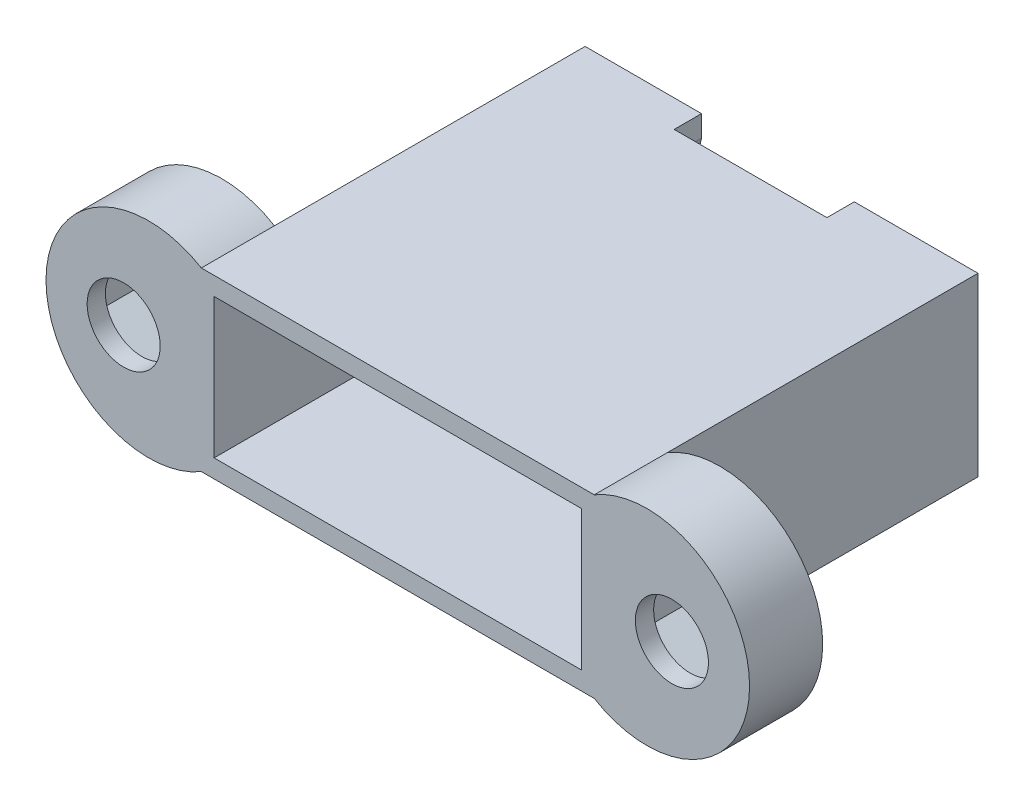
ISO-10303-21;
HEADER;
FILE_DESCRIPTION(('STEP AP214'),'2;1');
FILE_NAME('part.step','',(''),(''),'','','');
FILE_SCHEMA(('AUTOMOTIVE_DESIGN { 1 0 10303 214 1 1 1 1 }'));
ENDSEC;
DATA;
#1=APPLICATION_CONTEXT('core data for automotive mechanical design processes');
#2=APPLICATION_PROTOCOL_DEFINITION('international standard','automotive_design',2000,#1);
#3=PRODUCT_CONTEXT('',#1,'mechanical');
#4=PRODUCT('Part','Part','',(#3));
#5=PRODUCT_RELATED_PRODUCT_CATEGORY('part','',(#4));
#6=PRODUCT_DEFINITION_FORMATION('','',#4);
#7=PRODUCT_DEFINITION_CONTEXT('part definition',#1,'design');
#8=PRODUCT_DEFINITION('design','',#6,#7);
#9=PRODUCT_DEFINITION_SHAPE('','',#8);
#10=(LENGTH_UNIT() NAMED_UNIT(*) SI_UNIT(.MILLI.,.METRE.));
#11=(NAMED_UNIT(*) PLANE_ANGLE_UNIT() SI_UNIT($,.RADIAN.));
#12=(NAMED_UNIT(*) SI_UNIT($,.STERADIAN.) SOLID_ANGLE_UNIT());
#13=UNCERTAINTY_MEASURE_WITH_UNIT(LENGTH_MEASURE(1.E-05),#10,'distance_accuracy_value','');
#14=(GEOMETRIC_REPRESENTATION_CONTEXT(3) GLOBAL_UNCERTAINTY_ASSIGNED_CONTEXT((#13)) GLOBAL_UNIT_ASSIGNED_CONTEXT((#10,
#11,#12)) REPRESENTATION_CONTEXT('',''));
#15=CARTESIAN_POINT('',(0.,0.,0.));
#16=DIRECTION('',(0.,0.,1.));
#17=DIRECTION('',(1.,0.,0.));
#18=AXIS2_PLACEMENT_3D('',#15,#16,#17);
#19=CARTESIAN_POINT('',(-10.0783878504673,4.92646028037383,21.));
#20=DIRECTION('',(1.,0.,0.));
#21=DIRECTION('',(0.,0.,-1.));
#22=AXIS2_PLACEMENT_3D('',#19,#20,#21);
#23=PLANE('',#22);
#24=DIRECTION('',(0.,-1.,0.));
#25=VECTOR('',#24,1.);
#26=CARTESIAN_POINT('',(-10.0783878504673,4.92646028037383,17.));
#27=LINE('',#26,#25);
#28=CARTESIAN_POINT('',(-10.0783878504673,4.92646028037383,17.));
#29=VERTEX_POINT('',#28);
#30=CARTESIAN_POINT('',(-10.0783878504673,-4.72353971962617,17.));
#31=VERTEX_POINT('',#30);
#32=EDGE_CURVE('E435',#29,#31,#27,.T.);
#33=ORIENTED_EDGE('',*,*,#32,.F.);
#34=DIRECTION('',(0.,0.,-1.));
#35=VECTOR('',#34,1.);
#36=CARTESIAN_POINT('',(-10.0783878504673,4.92646028037383,21.));
#37=LINE('',#36,#35);
#38=CARTESIAN_POINT('',(-10.0783878504673,4.92646028037383,0.));
#39=VERTEX_POINT('',#38);
#40=EDGE_CURVE('E517',#29,#39,#37,.T.);
#41=ORIENTED_EDGE('',*,*,#40,.T.);
#42=DIRECTION('',(0.,-1.,0.));
#43=VECTOR('',#42,1.);
#44=CARTESIAN_POINT('',(-10.0783878504673,4.92646028037383,0.));
#45=LINE('',#44,#43);
#46=CARTESIAN_POINT('',(-10.0783878504673,-4.72353971962617,0.));
#47=VERTEX_POINT('',#46);
#48=EDGE_CURVE('E498',#39,#47,#45,.T.);
#49=ORIENTED_EDGE('',*,*,#48,.T.);
#50=DIRECTION('',(0.,0.,-1.));
#51=VECTOR('',#50,1.);
#52=CARTESIAN_POINT('',(-10.0783878504673,-4.72353971962617,21.));
#53=LINE('',#52,#51);
#54=EDGE_CURVE('E544',#31,#47,#53,.T.);
#55=ORIENTED_EDGE('',*,*,#54,.F.);
#56=EDGE_LOOP('',(#33,#41,#49,#55));
#57=FACE_BOUND('',#56,.T.);
#58=ADVANCED_FACE('F39',(#57),#23,.F.);
#59=CARTESIAN_POINT('',(-10.0783878504673,-4.72353971962617,21.));
#60=DIRECTION('',(0.,1.,0.));
#61=DIRECTION('',(0.,0.,1.));
#62=AXIS2_PLACEMENT_3D('',#59,#60,#61);
#63=PLANE('',#62);
#64=DIRECTION('',(1.,0.,0.));
#65=VECTOR('',#64,1.);
#66=CARTESIAN_POINT('',(-10.0783878504673,-4.72353971962617,0.));
#67=LINE('',#66,#65);
#68=CARTESIAN_POINT('',(11.4216121495327,-4.72353971962617,0.));
#69=VERTEX_POINT('',#68);
#70=EDGE_CURVE('E521',#47,#69,#67,.T.);
#71=ORIENTED_EDGE('',*,*,#70,.T.);
#72=DIRECTION('',(0.,0.,-1.));
#73=VECTOR('',#72,1.);
#74=CARTESIAN_POINT('',(11.4216121495327,-4.72353971962617,21.));
#75=LINE('',#74,#73);
#76=CARTESIAN_POINT('',(11.4216121495327,-4.72353971962617,17.));
#77=VERTEX_POINT('',#76);
#78=EDGE_CURVE('E540',#77,#69,#75,.T.);
#79=ORIENTED_EDGE('',*,*,#78,.F.);
#80=CARTESIAN_POINT('',(11.4216121495327,-4.72353971962617,21.));
#81=VERTEX_POINT('',#80);
#82=EDGE_CURVE('E541',#81,#77,#75,.T.);
#83=ORIENTED_EDGE('',*,*,#82,.F.);
#84=DIRECTION('',(1.,0.,0.));
#85=VECTOR('',#84,1.);
#86=CARTESIAN_POINT('',(-10.0783878504673,-4.72353971962617,21.));
#87=LINE('',#86,#85);
#88=CARTESIAN_POINT('',(-10.0783878504673,-4.72353971962617,21.));
#89=VERTEX_POINT('',#88);
#90=EDGE_CURVE('E508',#89,#81,#87,.T.);
#91=ORIENTED_EDGE('',*,*,#90,.F.);
#92=EDGE_CURVE('E545',#89,#31,#53,.T.);
#93=ORIENTED_EDGE('',*,*,#92,.T.);
#94=ORIENTED_EDGE('',*,*,#54,.T.);
#95=EDGE_LOOP('',(#71,#79,#83,#91,#93,#94));
#96=FACE_BOUND('',#95,.T.);
#97=ADVANCED_FACE('F629',(#96),#63,.F.);
#98=CARTESIAN_POINT('',(11.4216121495327,4.92646028037383,21.));
#99=DIRECTION('',(-1.,0.,0.));
#100=DIRECTION('',(0.,0.,1.));
#101=AXIS2_PLACEMENT_3D('',#98,#99,#100);
#102=PLANE('',#101);
#103=DIRECTION('',(0.,0.,-1.));
#104=VECTOR('',#103,1.);
#105=CARTESIAN_POINT('',(11.4216121495327,4.92646028037383,21.));
#106=LINE('',#105,#104);
#107=CARTESIAN_POINT('',(11.4216121495327,4.92646028037383,17.));
#108=VERTEX_POINT('',#107);
#109=CARTESIAN_POINT('',(11.4216121495327,4.92646028037383,0.));
#110=VERTEX_POINT('',#109);
#111=EDGE_CURVE('E535',#108,#110,#106,.T.);
#112=ORIENTED_EDGE('',*,*,#111,.F.);
#113=DIRECTION('',(0.,-1.,0.));
#114=VECTOR('',#113,1.);
#115=CARTESIAN_POINT('',(11.4216121495327,4.92646028037383,17.));
#116=LINE('',#115,#114);
#117=EDGE_CURVE('E357',#108,#77,#116,.T.);
#118=ORIENTED_EDGE('',*,*,#117,.T.);
#119=ORIENTED_EDGE('',*,*,#78,.T.);
#120=DIRECTION('',(0.,1.,0.));
#121=VECTOR('',#120,1.);
#122=CARTESIAN_POINT('',(11.4216121495327,4.92646028037383,0.));
#123=LINE('',#122,#121);
#124=EDGE_CURVE('E525',#69,#110,#123,.T.);
#125=ORIENTED_EDGE('',*,*,#124,.T.);
#126=EDGE_LOOP('',(#112,#118,#119,#125));
#127=FACE_BOUND('',#126,.T.);
#128=ADVANCED_FACE('F619',(#127),#102,.F.);
#129=CARTESIAN_POINT('',(-10.0783878504673,4.92646028037383,21.));
#130=DIRECTION('',(0.,-1.,0.));
#131=DIRECTION('',(0.,0.,-1.));
#132=AXIS2_PLACEMENT_3D('',#129,#130,#131);
#133=PLANE('',#132);
#134=DIRECTION('',(1.,0.,0.));
#135=VECTOR('',#134,1.);
#136=CARTESIAN_POINT('',(-3.70783881422554,4.92646028037383,1.49809119903921));
#137=LINE('',#136,#135);
#138=CARTESIAN_POINT('',(-3.70783881422554,4.92646028037383,1.49809119903921));
#139=VERTEX_POINT('',#138);
#140=CARTESIAN_POINT('',(4.65235531770603,4.92646028037383,1.49809119903921));
#141=VERTEX_POINT('',#140);
#142=EDGE_CURVE('E241',#139,#141,#137,.T.);
#143=ORIENTED_EDGE('',*,*,#142,.F.);
#144=DIRECTION('',(0.,0.,1.));
#145=VECTOR('',#144,1.);
#146=CARTESIAN_POINT('',(-3.70783881422554,4.92646028037383,0.));
#147=LINE('',#146,#145);
#148=CARTESIAN_POINT('',(-3.70783881422554,4.92646028037383,0.));
#149=VERTEX_POINT('',#148);
#150=EDGE_CURVE('E250',#149,#139,#147,.T.);
#151=ORIENTED_EDGE('',*,*,#150,.F.);
#152=DIRECTION('',(-1.,0.,0.));
#153=VECTOR('',#152,1.);
#154=CARTESIAN_POINT('',(-10.0783878504673,4.92646028037383,0.));
#155=LINE('',#154,#153);
#156=EDGE_CURVE('E529',#149,#39,#155,.T.);
#157=ORIENTED_EDGE('',*,*,#156,.T.);
#158=ORIENTED_EDGE('',*,*,#40,.F.);
#159=CARTESIAN_POINT('',(-10.0783878504673,4.92646028037383,21.));
#160=VERTEX_POINT('',#159);
#161=EDGE_CURVE('E532',#160,#29,#37,.T.);
#162=ORIENTED_EDGE('',*,*,#161,.F.);
#163=DIRECTION('',(-1.,0.,0.));
#164=VECTOR('',#163,1.);
#165=CARTESIAN_POINT('',(-10.0783878504673,4.92646028037383,21.));
#166=LINE('',#165,#164);
#167=CARTESIAN_POINT('',(11.4216121495327,4.92646028037383,21.));
#168=VERTEX_POINT('',#167);
#169=EDGE_CURVE('E512',#168,#160,#166,.T.);
#170=ORIENTED_EDGE('',*,*,#169,.F.);
#171=EDGE_CURVE('E536',#168,#108,#106,.T.);
#172=ORIENTED_EDGE('',*,*,#171,.T.);
#173=ORIENTED_EDGE('',*,*,#111,.T.);
#174=CARTESIAN_POINT('',(4.65235531770603,4.92646028037383,0.));
#175=VERTEX_POINT('',#174);
#176=EDGE_CURVE('E513',#110,#175,#155,.T.);
#177=ORIENTED_EDGE('',*,*,#176,.T.);
#178=DIRECTION('',(0.,0.,-1.));
#179=VECTOR('',#178,1.);
#180=CARTESIAN_POINT('',(4.65235531770603,4.92646028037383,0.));
#181=LINE('',#180,#179);
#182=EDGE_CURVE('E247',#141,#175,#181,.T.);
#183=ORIENTED_EDGE('',*,*,#182,.F.);
#184=EDGE_LOOP('',(#143,#151,#157,#158,#162,#170,#172,#173,#177,#183));
#185=FACE_BOUND('',#184,.T.);
#186=ADVANCED_FACE('F258',(#185),#133,.F.);
#187=CARTESIAN_POINT('',(0.,0.,21.));
#188=DIRECTION('',(0.,0.,1.));
#189=DIRECTION('',(1.,0.,0.));
#190=AXIS2_PLACEMENT_3D('',#187,#188,#189);
#191=PLANE('',#190);
#192=CARTESIAN_POINT('',(15.6716121495327,0.101460280373831,21.));
#193=DIRECTION('',(0.,0.,1.));
#194=DIRECTION('',(1.,0.,0.));
#195=AXIS2_PLACEMENT_3D('',#192,#193,#194);
#196=CIRCLE('',#195,2.);
#197=CARTESIAN_POINT('',(17.6716121495327,0.101460280373831,21.));
#198=VERTEX_POINT('',#197);
#199=EDGE_CURVE('E288',#198,#198,#196,.T.);
#200=ORIENTED_EDGE('',*,*,#199,.F.);
#201=EDGE_LOOP('',(#200));
#202=FACE_BOUND('',#201,.T.);
#203=CARTESIAN_POINT('',(-14.3283878504673,0.101460280373833,21.));
#204=DIRECTION('',(0.,0.,1.));
#205=DIRECTION('',(1.,0.,0.));
#206=AXIS2_PLACEMENT_3D('',#203,#204,#205);
#207=CIRCLE('',#206,2.);
#208=CARTESIAN_POINT('',(-12.3283878504673,0.101460280373833,21.));
#209=VERTEX_POINT('',#208);
#210=EDGE_CURVE('E367',#209,#209,#207,.T.);
#211=ORIENTED_EDGE('',*,*,#210,.F.);
#212=EDGE_LOOP('',(#211));
#213=FACE_BOUND('',#212,.T.);
#214=DIRECTION('',(0.,-1.,0.));
#215=VECTOR('',#214,1.);
#216=CARTESIAN_POINT('',(-9.37838785046729,3.92646028037383,21.));
#217=LINE('',#216,#215);
#218=CARTESIAN_POINT('',(-9.37838785046729,3.92646028037383,21.));
#219=VERTEX_POINT('',#218);
#220=CARTESIAN_POINT('',(-9.37838785046729,-3.72353971962617,21.));
#221=VERTEX_POINT('',#220);
#222=EDGE_CURVE('E459',#219,#221,#217,.T.);
#223=ORIENTED_EDGE('',*,*,#222,.F.);
#224=DIRECTION('',(-1.,0.,0.));
#225=VECTOR('',#224,1.);
#226=CARTESIAN_POINT('',(-9.37838785046729,3.92646028037383,21.));
#227=LINE('',#226,#225);
#228=CARTESIAN_POINT('',(10.7216121495327,3.92646028037383,21.));
#229=VERTEX_POINT('',#228);
#230=EDGE_CURVE('E468',#229,#219,#227,.T.);
#231=ORIENTED_EDGE('',*,*,#230,.F.);
#232=DIRECTION('',(0.,1.,0.));
#233=VECTOR('',#232,1.);
#234=CARTESIAN_POINT('',(10.7216121495327,3.92646028037383,21.));
#235=LINE('',#234,#233);
#236=CARTESIAN_POINT('',(10.7216121495327,-3.72353971962617,21.));
#237=VERTEX_POINT('',#236);
#238=EDGE_CURVE('E488',#237,#229,#235,.T.);
#239=ORIENTED_EDGE('',*,*,#238,.F.);
#240=DIRECTION('',(1.,0.,0.));
#241=VECTOR('',#240,1.);
#242=CARTESIAN_POINT('',(-9.37838785046729,-3.72353971962617,21.));
#243=LINE('',#242,#241);
#244=EDGE_CURVE('E484',#221,#237,#243,.T.);
#245=ORIENTED_EDGE('',*,*,#244,.F.);
#246=EDGE_LOOP('',(#223,#231,#239,#245));
#247=FACE_BOUND('',#246,.T.);
#248=ORIENTED_EDGE('',*,*,#169,.T.);
#249=CARTESIAN_POINT('',(-12.9589393210555,0.101460280373833,21.));
#250=DIRECTION('',(0.,0.,1.));
#251=DIRECTION('',(1.,0.,0.));
#252=AXIS2_PLACEMENT_3D('',#249,#250,#251);
#253=CIRCLE('',#252,5.61944852941176);
#254=EDGE_CURVE('E419',#160,#89,#253,.T.);
#255=ORIENTED_EDGE('',*,*,#254,.T.);
#256=ORIENTED_EDGE('',*,*,#90,.T.);
#257=CARTESIAN_POINT('',(14.3021636201209,0.101460280373833,21.));
#258=DIRECTION('',(0.,0.,1.));
#259=DIRECTION('',(-1.,0.,0.));
#260=AXIS2_PLACEMENT_3D('',#257,#258,#259);
#261=CIRCLE('',#260,5.61944852941177);
#262=EDGE_CURVE('E339',#81,#168,#261,.T.);
#263=ORIENTED_EDGE('',*,*,#262,.T.);
#264=EDGE_LOOP('',(#248,#255,#256,#263));
#265=FACE_BOUND('',#264,.T.);
#266=ADVANCED_FACE('F662',(#202,#213,#247,#265),#191,.T.);
#267=CARTESIAN_POINT('',(0.,0.,0.));
#268=DIRECTION('',(0.,0.,1.));
#269=DIRECTION('',(1.,0.,0.));
#270=AXIS2_PLACEMENT_3D('',#267,#268,#269);
#271=PLANE('',#270);
#272=ORIENTED_EDGE('',*,*,#156,.F.);
#273=DIRECTION('',(0.,1.,0.));
#274=VECTOR('',#273,1.);
#275=CARTESIAN_POINT('',(-3.70783881422554,2.92646028037383,0.));
#276=LINE('',#275,#274);
#277=CARTESIAN_POINT('',(-3.70783881422554,3.76834040682396,0.));
#278=VERTEX_POINT('',#277);
#279=EDGE_CURVE('E253',#278,#149,#276,.T.);
#280=ORIENTED_EDGE('',*,*,#279,.F.);
#281=CARTESIAN_POINT('',(-0.828387850467288,2.92646028037383,0.));
#282=DIRECTION('',(0.,0.,1.));
#283=DIRECTION('',(1.,0.,0.));
#284=AXIS2_PLACEMENT_3D('',#281,#282,#283);
#285=CIRCLE('',#284,3.);
#286=CARTESIAN_POINT('',(-0.828387850467288,-0.0735397196261661,0.));
#287=VERTEX_POINT('',#286);
#288=EDGE_CURVE('E557',#278,#287,#285,.T.);
#289=ORIENTED_EDGE('',*,*,#288,.T.);
#290=DIRECTION('',(1.,0.,0.));
#291=VECTOR('',#290,1.);
#292=CARTESIAN_POINT('',(0.,-0.0735397196261661,0.));
#293=LINE('',#292,#291);
#294=CARTESIAN_POINT('',(1.67161214953271,-0.073539719626166,0.));
#295=VERTEX_POINT('',#294);
#296=EDGE_CURVE('E549',#287,#295,#293,.T.);
#297=ORIENTED_EDGE('',*,*,#296,.T.);
#298=CARTESIAN_POINT('',(1.67161214953271,2.92646028037383,0.));
#299=DIRECTION('',(0.,0.,1.));
#300=DIRECTION('',(1.,0.,0.));
#301=AXIS2_PLACEMENT_3D('',#298,#299,#300);
#302=CIRCLE('',#301,3.);
#303=CARTESIAN_POINT('',(4.65235531770603,3.26582758196326,0.));
#304=VERTEX_POINT('',#303);
#305=EDGE_CURVE('E553',#295,#304,#302,.T.);
#306=ORIENTED_EDGE('',*,*,#305,.T.);
#307=DIRECTION('',(0.,1.,0.));
#308=VECTOR('',#307,1.);
#309=CARTESIAN_POINT('',(4.65235531770603,2.92646028037383,0.));
#310=LINE('',#309,#308);
#311=EDGE_CURVE('E54',#304,#175,#310,.T.);
#312=ORIENTED_EDGE('',*,*,#311,.T.);
#313=ORIENTED_EDGE('',*,*,#176,.F.);
#314=ORIENTED_EDGE('',*,*,#124,.F.);
#315=ORIENTED_EDGE('',*,*,#70,.F.);
#316=ORIENTED_EDGE('',*,*,#48,.F.);
#317=EDGE_LOOP('',(#272,#280,#289,#297,#306,#312,#313,#314,#315,#316));
#318=FACE_BOUND('',#317,.T.);
#319=ADVANCED_FACE('F589',(#318),#271,.F.);
#320=CARTESIAN_POINT('',(-9.37838785046729,3.92646028037383,1.4));
#321=DIRECTION('',(-1.,0.,0.));
#322=DIRECTION('',(0.,-1.,0.));
#323=AXIS2_PLACEMENT_3D('',#320,#321,#322);
#324=PLANE('',#323);
#325=ORIENTED_EDGE('',*,*,#222,.T.);
#326=DIRECTION('',(0.,0.,1.));
#327=VECTOR('',#326,1.);
#328=CARTESIAN_POINT('',(-9.37838785046729,-3.72353971962617,1.4));
#329=LINE('',#328,#327);
#330=CARTESIAN_POINT('',(-9.37838785046729,-3.72353971962617,1.4));
#331=VERTEX_POINT('',#330);
#332=EDGE_CURVE('E481',#331,#221,#329,.T.);
#333=ORIENTED_EDGE('',*,*,#332,.F.);
#334=DIRECTION('',(0.,-1.,0.));
#335=VECTOR('',#334,1.);
#336=CARTESIAN_POINT('',(-9.37838785046729,3.92646028037383,1.4));
#337=LINE('',#336,#335);
#338=CARTESIAN_POINT('',(-9.37838785046729,3.92646028037383,1.4));
#339=VERTEX_POINT('',#338);
#340=EDGE_CURVE('E463',#339,#331,#337,.T.);
#341=ORIENTED_EDGE('',*,*,#340,.F.);
#342=DIRECTION('',(0.,0.,1.));
#343=VECTOR('',#342,1.);
#344=CARTESIAN_POINT('',(-9.37838785046729,3.92646028037383,1.4));
#345=LINE('',#344,#343);
#346=EDGE_CURVE('E495',#339,#219,#345,.T.);
#347=ORIENTED_EDGE('',*,*,#346,.T.);
#348=EDGE_LOOP('',(#325,#333,#341,#347));
#349=FACE_BOUND('',#348,.T.);
#350=ADVANCED_FACE('F603',(#349),#324,.F.);
#351=CARTESIAN_POINT('',(-9.37838785046729,3.92646028037383,1.4));
#352=DIRECTION('',(0.,1.,0.));
#353=DIRECTION('',(-1.,0.,0.));
#354=AXIS2_PLACEMENT_3D('',#351,#352,#353);
#355=PLANE('',#354);
#356=DIRECTION('',(-1.,0.,0.));
#357=VECTOR('',#356,1.);
#358=CARTESIAN_POINT('',(-9.37838785046729,3.92646028037383,1.4));
#359=LINE('',#358,#357);
#360=CARTESIAN_POINT('',(-3.70783881422554,3.92646028037383,1.4));
#361=VERTEX_POINT('',#360);
#362=EDGE_CURVE('E476',#361,#339,#359,.T.);
#363=ORIENTED_EDGE('',*,*,#362,.F.);
#364=DIRECTION('',(0.,0.,1.));
#365=VECTOR('',#364,1.);
#366=CARTESIAN_POINT('',(-3.70783881422554,3.92646028037383,1.4));
#367=LINE('',#366,#365);
#368=CARTESIAN_POINT('',(-3.70783881422554,3.92646028037383,1.49809119903921));
#369=VERTEX_POINT('',#368);
#370=EDGE_CURVE('E281',#361,#369,#367,.T.);
#371=ORIENTED_EDGE('',*,*,#370,.T.);
#372=DIRECTION('',(1.,0.,0.));
#373=VECTOR('',#372,1.);
#374=CARTESIAN_POINT('',(-9.37838785046729,3.92646028037383,1.49809119903921));
#375=LINE('',#374,#373);
#376=CARTESIAN_POINT('',(4.65235531770603,3.92646028037383,1.49809119903921));
#377=VERTEX_POINT('',#376);
#378=EDGE_CURVE('E11',#369,#377,#375,.T.);
#379=ORIENTED_EDGE('',*,*,#378,.T.);
#380=DIRECTION('',(0.,0.,-1.));
#381=VECTOR('',#380,1.);
#382=CARTESIAN_POINT('',(4.65235531770603,3.92646028037383,1.4));
#383=LINE('',#382,#381);
#384=CARTESIAN_POINT('',(4.65235531770603,3.92646028037383,1.4));
#385=VERTEX_POINT('',#384);
#386=EDGE_CURVE('E274',#377,#385,#383,.T.);
#387=ORIENTED_EDGE('',*,*,#386,.T.);
#388=CARTESIAN_POINT('',(10.7216121495327,3.92646028037383,1.4));
#389=VERTEX_POINT('',#388);
#390=EDGE_CURVE('E477',#389,#385,#359,.T.);
#391=ORIENTED_EDGE('',*,*,#390,.F.);
#392=DIRECTION('',(0.,0.,1.));
#393=VECTOR('',#392,1.);
#394=CARTESIAN_POINT('',(10.7216121495327,3.92646028037383,1.4));
#395=LINE('',#394,#393);
#396=EDGE_CURVE('E499',#389,#229,#395,.T.);
#397=ORIENTED_EDGE('',*,*,#396,.T.);
#398=ORIENTED_EDGE('',*,*,#230,.T.);
#399=ORIENTED_EDGE('',*,*,#346,.F.);
#400=EDGE_LOOP('',(#363,#371,#379,#387,#391,#397,#398,#399));
#401=FACE_BOUND('',#400,.T.);
#402=ADVANCED_FACE('F599',(#401),#355,.F.);
#403=CARTESIAN_POINT('',(10.7216121495327,3.92646028037383,1.4));
#404=DIRECTION('',(1.,0.,0.));
#405=DIRECTION('',(0.,1.,0.));
#406=AXIS2_PLACEMENT_3D('',#403,#404,#405);
#407=PLANE('',#406);
#408=ORIENTED_EDGE('',*,*,#238,.T.);
#409=ORIENTED_EDGE('',*,*,#396,.F.);
#410=DIRECTION('',(0.,1.,0.));
#411=VECTOR('',#410,1.);
#412=CARTESIAN_POINT('',(10.7216121495327,3.92646028037383,1.4));
#413=LINE('',#412,#411);
#414=CARTESIAN_POINT('',(10.7216121495327,-3.72353971962617,1.4));
#415=VERTEX_POINT('',#414);
#416=EDGE_CURVE('E472',#415,#389,#413,.T.);
#417=ORIENTED_EDGE('',*,*,#416,.F.);
#418=DIRECTION('',(0.,0.,1.));
#419=VECTOR('',#418,1.);
#420=CARTESIAN_POINT('',(10.7216121495327,-3.72353971962617,1.4));
#421=LINE('',#420,#419);
#422=EDGE_CURVE('E502',#415,#237,#421,.T.);
#423=ORIENTED_EDGE('',*,*,#422,.T.);
#424=EDGE_LOOP('',(#408,#409,#417,#423));
#425=FACE_BOUND('',#424,.T.);
#426=ADVANCED_FACE('F672',(#425),#407,.F.);
#427=CARTESIAN_POINT('',(-9.37838785046729,-3.72353971962617,1.4));
#428=DIRECTION('',(0.,-1.,0.));
#429=DIRECTION('',(0.,0.,-1.));
#430=AXIS2_PLACEMENT_3D('',#427,#428,#429);
#431=PLANE('',#430);
#432=ORIENTED_EDGE('',*,*,#244,.T.);
#433=ORIENTED_EDGE('',*,*,#422,.F.);
#434=DIRECTION('',(1.,0.,0.));
#435=VECTOR('',#434,1.);
#436=CARTESIAN_POINT('',(-9.37838785046729,-3.72353971962617,1.4));
#437=LINE('',#436,#435);
#438=EDGE_CURVE('E467',#331,#415,#437,.T.);
#439=ORIENTED_EDGE('',*,*,#438,.F.);
#440=ORIENTED_EDGE('',*,*,#332,.T.);
#441=EDGE_LOOP('',(#432,#433,#439,#440));
#442=FACE_BOUND('',#441,.T.);
#443=ADVANCED_FACE('F607',(#442),#431,.F.);
#444=CARTESIAN_POINT('',(0.,0.,1.4));
#445=DIRECTION('',(0.,0.,1.));
#446=DIRECTION('',(1.,0.,0.));
#447=AXIS2_PLACEMENT_3D('',#444,#445,#446);
#448=PLANE('',#447);
#449=DIRECTION('',(0.,-1.,0.));
#450=VECTOR('',#449,1.);
#451=CARTESIAN_POINT('',(-3.70783881422554,0.,1.4));
#452=LINE('',#451,#450);
#453=CARTESIAN_POINT('',(-3.70783881422554,3.76834040682396,1.4));
#454=VERTEX_POINT('',#453);
#455=EDGE_CURVE('E278',#361,#454,#452,.T.);
#456=ORIENTED_EDGE('',*,*,#455,.F.);
#457=ORIENTED_EDGE('',*,*,#362,.T.);
#458=ORIENTED_EDGE('',*,*,#340,.T.);
#459=ORIENTED_EDGE('',*,*,#438,.T.);
#460=ORIENTED_EDGE('',*,*,#416,.T.);
#461=ORIENTED_EDGE('',*,*,#390,.T.);
#462=DIRECTION('',(0.,1.,0.));
#463=VECTOR('',#462,1.);
#464=CARTESIAN_POINT('',(4.65235531770603,0.,1.4));
#465=LINE('',#464,#463);
#466=CARTESIAN_POINT('',(4.65235531770603,3.26582758196326,1.4));
#467=VERTEX_POINT('',#466);
#468=EDGE_CURVE('E267',#467,#385,#465,.T.);
#469=ORIENTED_EDGE('',*,*,#468,.F.);
#470=CARTESIAN_POINT('',(1.67161214953271,2.92646028037383,1.4));
#471=DIRECTION('',(0.,0.,1.));
#472=DIRECTION('',(1.,0.,0.));
#473=AXIS2_PLACEMENT_3D('',#470,#471,#472);
#474=CIRCLE('',#473,3.);
#475=CARTESIAN_POINT('',(1.67161214953271,-0.0735397196261656,1.4));
#476=VERTEX_POINT('',#475);
#477=EDGE_CURVE('E450',#476,#467,#474,.T.);
#478=ORIENTED_EDGE('',*,*,#477,.F.);
#479=DIRECTION('',(1.,0.,0.));
#480=VECTOR('',#479,1.);
#481=CARTESIAN_POINT('',(-0.828387850467288,-0.0735397196261661,1.4));
#482=LINE('',#481,#480);
#483=CARTESIAN_POINT('',(-0.828387850467288,-0.0735397196261661,1.4));
#484=VERTEX_POINT('',#483);
#485=EDGE_CURVE('E447',#484,#476,#482,.T.);
#486=ORIENTED_EDGE('',*,*,#485,.F.);
#487=CARTESIAN_POINT('',(-0.828387850467288,2.92646028037383,1.4));
#488=DIRECTION('',(0.,0.,1.));
#489=DIRECTION('',(1.,0.,0.));
#490=AXIS2_PLACEMENT_3D('',#487,#488,#489);
#491=CIRCLE('',#490,3.);
#492=EDGE_CURVE('E442',#454,#484,#491,.T.);
#493=ORIENTED_EDGE('',*,*,#492,.F.);
#494=EDGE_LOOP('',(#456,#457,#458,#459,#460,#461,#469,#478,#486,#493));
#495=FACE_BOUND('',#494,.T.);
#496=ADVANCED_FACE('F578',(#495),#448,.T.);
#497=CARTESIAN_POINT('',(-0.828387850467288,2.92646028037383,-18.2));
#498=DIRECTION('',(0.,0.,1.));
#499=DIRECTION('',(1.,0.,0.));
#500=AXIS2_PLACEMENT_3D('',#497,#498,#499);
#501=CYLINDRICAL_SURFACE('',#500,3.);
#502=ORIENTED_EDGE('',*,*,#288,.F.);
#503=DIRECTION('',(0.,0.,1.));
#504=VECTOR('',#503,1.);
#505=CARTESIAN_POINT('',(-3.70783881422554,3.76834040682396,-18.2));
#506=LINE('',#505,#504);
#507=EDGE_CURVE('E47',#278,#454,#506,.T.);
#508=ORIENTED_EDGE('',*,*,#507,.T.);
#509=ORIENTED_EDGE('',*,*,#492,.T.);
#510=DIRECTION('',(0.,0.,1.));
#511=VECTOR('',#510,1.);
#512=CARTESIAN_POINT('',(-0.828387850467288,-0.0735397196261661,-18.2));
#513=LINE('',#512,#511);
#514=EDGE_CURVE('E454',#287,#484,#513,.T.);
#515=ORIENTED_EDGE('',*,*,#514,.F.);
#516=EDGE_LOOP('',(#502,#508,#509,#515));
#517=FACE_BOUND('',#516,.T.);
#518=ADVANCED_FACE('F573',(#517),#501,.F.);
#519=CARTESIAN_POINT('',(1.67161214953271,2.92646028037383,-18.2));
#520=DIRECTION('',(0.,0.,1.));
#521=DIRECTION('',(1.,0.,0.));
#522=AXIS2_PLACEMENT_3D('',#519,#520,#521);
#523=CYLINDRICAL_SURFACE('',#522,3.);
#524=ORIENTED_EDGE('',*,*,#477,.T.);
#525=DIRECTION('',(0.,0.,1.));
#526=VECTOR('',#525,1.);
#527=CARTESIAN_POINT('',(4.65235531770603,3.26582758196326,-18.2));
#528=LINE('',#527,#526);
#529=EDGE_CURVE('E560',#467,#304,#528,.F.);
#530=ORIENTED_EDGE('',*,*,#529,.T.);
#531=ORIENTED_EDGE('',*,*,#305,.F.);
#532=DIRECTION('',(0.,0.,1.));
#533=VECTOR('',#532,1.);
#534=CARTESIAN_POINT('',(1.67161214953271,-0.0735397196261656,-18.2));
#535=LINE('',#534,#533);
#536=EDGE_CURVE('E455',#295,#476,#535,.T.);
#537=ORIENTED_EDGE('',*,*,#536,.T.);
#538=EDGE_LOOP('',(#524,#530,#531,#537));
#539=FACE_BOUND('',#538,.T.);
#540=ADVANCED_FACE('F587',(#539),#523,.F.);
#541=CARTESIAN_POINT('',(-0.828387850467288,-0.0735397196261661,-18.2));
#542=DIRECTION('',(0.,-1.,0.));
#543=DIRECTION('',(1.,0.,0.));
#544=AXIS2_PLACEMENT_3D('',#541,#542,#543);
#545=PLANE('',#544);
#546=ORIENTED_EDGE('',*,*,#514,.T.);
#547=ORIENTED_EDGE('',*,*,#485,.T.);
#548=ORIENTED_EDGE('',*,*,#536,.F.);
#549=ORIENTED_EDGE('',*,*,#296,.F.);
#550=EDGE_LOOP('',(#546,#547,#548,#549));
#551=FACE_BOUND('',#550,.T.);
#552=ADVANCED_FACE('F583',(#551),#545,.F.);
#553=CARTESIAN_POINT('',(-12.9589393210555,0.101460280373833,17.));
#554=DIRECTION('',(0.,0.,1.));
#555=DIRECTION('',(1.,0.,0.));
#556=AXIS2_PLACEMENT_3D('',#553,#554,#555);
#557=CYLINDRICAL_SURFACE('',#556,5.61944852941176);
#558=ORIENTED_EDGE('',*,*,#254,.F.);
#559=ORIENTED_EDGE('',*,*,#161,.T.);
#560=CARTESIAN_POINT('',(-12.9589393210555,0.101460280373833,17.));
#561=DIRECTION('',(0.,0.,1.));
#562=DIRECTION('',(1.,0.,0.));
#563=AXIS2_PLACEMENT_3D('',#560,#561,#562);
#564=CIRCLE('',#563,5.61944852941176);
#565=EDGE_CURVE('E438',#29,#31,#564,.T.);
#566=ORIENTED_EDGE('',*,*,#565,.T.);
#567=ORIENTED_EDGE('',*,*,#92,.F.);
#568=EDGE_LOOP('',(#558,#559,#566,#567));
#569=FACE_BOUND('',#568,.T.);
#570=ADVANCED_FACE('F634',(#569),#557,.T.);
#571=CARTESIAN_POINT('',(-12.9589393210555,0.101460280373833,17.));
#572=DIRECTION('',(0.,0.,1.));
#573=DIRECTION('',(1.,0.,0.));
#574=AXIS2_PLACEMENT_3D('',#571,#572,#573);
#575=PLANE('',#574);
#576=DIRECTION('',(0.866025403784439,-0.5,0.));
#577=VECTOR('',#576,1.);
#578=CARTESIAN_POINT('',(-14.3283878504673,3.85146028037383,17.));
#579=LINE('',#578,#577);
#580=CARTESIAN_POINT('',(-14.3283878504673,3.85146028037383,17.));
#581=VERTEX_POINT('',#580);
#582=CARTESIAN_POINT('',(-11.0807925862756,1.97646028037383,17.));
#583=VERTEX_POINT('',#582);
#584=EDGE_CURVE('E397',#581,#583,#579,.T.);
#585=ORIENTED_EDGE('',*,*,#584,.F.);
#586=DIRECTION('',(0.866025403784439,0.5,0.));
#587=VECTOR('',#586,1.);
#588=CARTESIAN_POINT('',(-17.5759831146589,1.97646028037383,17.));
#589=LINE('',#588,#587);
#590=CARTESIAN_POINT('',(-17.5759831146589,1.97646028037383,17.));
#591=VERTEX_POINT('',#590);
#592=EDGE_CURVE('E394',#591,#581,#589,.T.);
#593=ORIENTED_EDGE('',*,*,#592,.F.);
#594=DIRECTION('',(0.,1.,0.));
#595=VECTOR('',#594,1.);
#596=CARTESIAN_POINT('',(-17.5759831146589,-1.77353971962617,17.));
#597=LINE('',#596,#595);
#598=CARTESIAN_POINT('',(-17.5759831146589,-1.77353971962617,17.));
#599=VERTEX_POINT('',#598);
#600=EDGE_CURVE('E373',#599,#591,#597,.T.);
#601=ORIENTED_EDGE('',*,*,#600,.F.);
#602=DIRECTION('',(-0.866025403784439,0.5,0.));
#603=VECTOR('',#602,1.);
#604=CARTESIAN_POINT('',(-14.3283878504673,-3.64853971962617,17.));
#605=LINE('',#604,#603);
#606=CARTESIAN_POINT('',(-14.3283878504673,-3.64853971962617,17.));
#607=VERTEX_POINT('',#606);
#608=EDGE_CURVE('E409',#607,#599,#605,.T.);
#609=ORIENTED_EDGE('',*,*,#608,.F.);
#610=DIRECTION('',(-0.866025403784439,-0.5,0.));
#611=VECTOR('',#610,1.);
#612=CARTESIAN_POINT('',(-11.0807925862756,-1.77353971962617,17.));
#613=LINE('',#612,#611);
#614=CARTESIAN_POINT('',(-11.0807925862756,-1.77353971962617,17.));
#615=VERTEX_POINT('',#614);
#616=EDGE_CURVE('E405',#615,#607,#613,.T.);
#617=ORIENTED_EDGE('',*,*,#616,.F.);
#618=DIRECTION('',(0.,-1.,0.));
#619=VECTOR('',#618,1.);
#620=CARTESIAN_POINT('',(-11.0807925862756,1.97646028037383,17.));
#621=LINE('',#620,#619);
#622=EDGE_CURVE('E401',#583,#615,#621,.T.);
#623=ORIENTED_EDGE('',*,*,#622,.F.);
#624=EDGE_LOOP('',(#585,#593,#601,#609,#617,#623));
#625=FACE_BOUND('',#624,.T.);
#626=ORIENTED_EDGE('',*,*,#32,.T.);
#627=ORIENTED_EDGE('',*,*,#565,.F.);
#628=EDGE_LOOP('',(#626,#627));
#629=FACE_BOUND('',#628,.T.);
#630=ADVANCED_FACE('F637',(#625,#629),#575,.F.);
#631=CARTESIAN_POINT('',(-17.5759831146589,1.97646028037383,20.));
#632=DIRECTION('',(-0.5,0.866025403784439,0.));
#633=DIRECTION('',(-0.866025403784439,-0.5,0.));
#634=AXIS2_PLACEMENT_3D('',#631,#632,#633);
#635=PLANE('',#634);
#636=ORIENTED_EDGE('',*,*,#592,.T.);
#637=DIRECTION('',(0.,0.,-1.));
#638=VECTOR('',#637,1.);
#639=CARTESIAN_POINT('',(-14.3283878504673,3.85146028037383,20.));
#640=LINE('',#639,#638);
#641=CARTESIAN_POINT('',(-14.3283878504673,3.85146028037383,20.));
#642=VERTEX_POINT('',#641);
#643=EDGE_CURVE('E393',#642,#581,#640,.T.);
#644=ORIENTED_EDGE('',*,*,#643,.F.);
#645=DIRECTION('',(0.866025403784439,0.5,0.));
#646=VECTOR('',#645,1.);
#647=CARTESIAN_POINT('',(-17.5759831146589,1.97646028037383,20.));
#648=LINE('',#647,#646);
#649=CARTESIAN_POINT('',(-17.5759831146589,1.97646028037383,20.));
#650=VERTEX_POINT('',#649);
#651=EDGE_CURVE('E368',#650,#642,#648,.T.);
#652=ORIENTED_EDGE('',*,*,#651,.F.);
#653=DIRECTION('',(0.,0.,-1.));
#654=VECTOR('',#653,1.);
#655=CARTESIAN_POINT('',(-17.5759831146589,1.97646028037383,20.));
#656=LINE('',#655,#654);
#657=EDGE_CURVE('E416',#650,#591,#656,.T.);
#658=ORIENTED_EDGE('',*,*,#657,.T.);
#659=EDGE_LOOP('',(#636,#644,#652,#658));
#660=FACE_BOUND('',#659,.T.);
#661=ADVANCED_FACE('F639',(#660),#635,.F.);
#662=CARTESIAN_POINT('',(-17.5759831146589,-1.77353971962617,20.));
#663=DIRECTION('',(-1.,0.,0.));
#664=DIRECTION('',(0.,0.,1.));
#665=AXIS2_PLACEMENT_3D('',#662,#663,#664);
#666=PLANE('',#665);
#667=ORIENTED_EDGE('',*,*,#600,.T.);
#668=ORIENTED_EDGE('',*,*,#657,.F.);
#669=DIRECTION('',(0.,1.,0.));
#670=VECTOR('',#669,1.);
#671=CARTESIAN_POINT('',(-17.5759831146589,-1.77353971962617,20.));
#672=LINE('',#671,#670);
#673=CARTESIAN_POINT('',(-17.5759831146589,-1.77353971962617,20.));
#674=VERTEX_POINT('',#673);
#675=EDGE_CURVE('E389',#674,#650,#672,.T.);
#676=ORIENTED_EDGE('',*,*,#675,.F.);
#677=DIRECTION('',(0.,0.,-1.));
#678=VECTOR('',#677,1.);
#679=CARTESIAN_POINT('',(-17.5759831146589,-1.77353971962617,20.));
#680=LINE('',#679,#678);
#681=EDGE_CURVE('E420',#674,#599,#680,.T.);
#682=ORIENTED_EDGE('',*,*,#681,.T.);
#683=EDGE_LOOP('',(#667,#668,#676,#682));
#684=FACE_BOUND('',#683,.T.);
#685=ADVANCED_FACE('F646',(#684),#666,.F.);
#686=CARTESIAN_POINT('',(-14.3283878504673,-3.64853971962617,20.));
#687=DIRECTION('',(-0.5,-0.866025403784439,0.));
#688=DIRECTION('',(0.866025403784439,-0.5,0.));
#689=AXIS2_PLACEMENT_3D('',#686,#687,#688);
#690=PLANE('',#689);
#691=ORIENTED_EDGE('',*,*,#608,.T.);
#692=ORIENTED_EDGE('',*,*,#681,.F.);
#693=DIRECTION('',(-0.866025403784439,0.5,0.));
#694=VECTOR('',#693,1.);
#695=CARTESIAN_POINT('',(-14.3283878504673,-3.64853971962617,20.));
#696=LINE('',#695,#694);
#697=CARTESIAN_POINT('',(-14.3283878504673,-3.64853971962617,20.));
#698=VERTEX_POINT('',#697);
#699=EDGE_CURVE('E385',#698,#674,#696,.T.);
#700=ORIENTED_EDGE('',*,*,#699,.F.);
#701=DIRECTION('',(0.,0.,-1.));
#702=VECTOR('',#701,1.);
#703=CARTESIAN_POINT('',(-14.3283878504673,-3.64853971962617,20.));
#704=LINE('',#703,#702);
#705=EDGE_CURVE('E423',#698,#607,#704,.T.);
#706=ORIENTED_EDGE('',*,*,#705,.T.);
#707=EDGE_LOOP('',(#691,#692,#700,#706));
#708=FACE_BOUND('',#707,.T.);
#709=ADVANCED_FACE('F720',(#708),#690,.F.);
#710=CARTESIAN_POINT('',(-11.0807925862756,-1.77353971962617,20.));
#711=DIRECTION('',(0.5,-0.866025403784439,0.));
#712=DIRECTION('',(0.866025403784439,0.5,0.));
#713=AXIS2_PLACEMENT_3D('',#710,#711,#712);
#714=PLANE('',#713);
#715=ORIENTED_EDGE('',*,*,#616,.T.);
#716=ORIENTED_EDGE('',*,*,#705,.F.);
#717=DIRECTION('',(-0.866025403784439,-0.5,0.));
#718=VECTOR('',#717,1.);
#719=CARTESIAN_POINT('',(-11.0807925862756,-1.77353971962617,20.));
#720=LINE('',#719,#718);
#721=CARTESIAN_POINT('',(-11.0807925862756,-1.77353971962617,20.));
#722=VERTEX_POINT('',#721);
#723=EDGE_CURVE('E381',#722,#698,#720,.T.);
#724=ORIENTED_EDGE('',*,*,#723,.F.);
#725=DIRECTION('',(0.,0.,-1.));
#726=VECTOR('',#725,1.);
#727=CARTESIAN_POINT('',(-11.0807925862756,-1.77353971962617,20.));
#728=LINE('',#727,#726);
#729=EDGE_CURVE('E426',#722,#615,#728,.T.);
#730=ORIENTED_EDGE('',*,*,#729,.T.);
#731=EDGE_LOOP('',(#715,#716,#724,#730));
#732=FACE_BOUND('',#731,.T.);
#733=ADVANCED_FACE('F730',(#732),#714,.F.);
#734=CARTESIAN_POINT('',(-11.0807925862756,1.97646028037383,20.));
#735=DIRECTION('',(1.,0.,0.));
#736=DIRECTION('',(0.,0.,-1.));
#737=AXIS2_PLACEMENT_3D('',#734,#735,#736);
#738=PLANE('',#737);
#739=ORIENTED_EDGE('',*,*,#622,.T.);
#740=ORIENTED_EDGE('',*,*,#729,.F.);
#741=DIRECTION('',(0.,-1.,0.));
#742=VECTOR('',#741,1.);
#743=CARTESIAN_POINT('',(-11.0807925862756,1.97646028037383,20.));
#744=LINE('',#743,#742);
#745=CARTESIAN_POINT('',(-11.0807925862756,1.97646028037383,20.));
#746=VERTEX_POINT('',#745);
#747=EDGE_CURVE('E377',#746,#722,#744,.T.);
#748=ORIENTED_EDGE('',*,*,#747,.F.);
#749=DIRECTION('',(0.,0.,-1.));
#750=VECTOR('',#749,1.);
#751=CARTESIAN_POINT('',(-11.0807925862756,1.97646028037383,20.));
#752=LINE('',#751,#750);
#753=EDGE_CURVE('E429',#746,#583,#752,.T.);
#754=ORIENTED_EDGE('',*,*,#753,.T.);
#755=EDGE_LOOP('',(#739,#740,#748,#754));
#756=FACE_BOUND('',#755,.T.);
#757=ADVANCED_FACE('F740',(#756),#738,.F.);
#758=CARTESIAN_POINT('',(-14.3283878504673,3.85146028037383,20.));
#759=DIRECTION('',(0.5,0.866025403784439,0.));
#760=DIRECTION('',(-0.866025403784439,0.5,0.));
#761=AXIS2_PLACEMENT_3D('',#758,#759,#760);
#762=PLANE('',#761);
#763=ORIENTED_EDGE('',*,*,#584,.T.);
#764=ORIENTED_EDGE('',*,*,#753,.F.);
#765=DIRECTION('',(0.866025403784439,-0.5,0.));
#766=VECTOR('',#765,1.);
#767=CARTESIAN_POINT('',(-14.3283878504673,3.85146028037383,20.));
#768=LINE('',#767,#766);
#769=EDGE_CURVE('E372',#642,#746,#768,.T.);
#770=ORIENTED_EDGE('',*,*,#769,.F.);
#771=ORIENTED_EDGE('',*,*,#643,.T.);
#772=EDGE_LOOP('',(#763,#764,#770,#771));
#773=FACE_BOUND('',#772,.T.);
#774=ADVANCED_FACE('F750',(#773),#762,.F.);
#775=CARTESIAN_POINT('',(0.,0.,20.));
#776=DIRECTION('',(0.,0.,-1.));
#777=DIRECTION('',(-1.,0.,0.));
#778=AXIS2_PLACEMENT_3D('',#775,#776,#777);
#779=PLANE('',#778);
#780=CARTESIAN_POINT('',(-14.3283878504673,0.101460280373833,20.));
#781=DIRECTION('',(0.,0.,-1.));
#782=DIRECTION('',(-1.,0.,0.));
#783=AXIS2_PLACEMENT_3D('',#780,#781,#782);
#784=CIRCLE('',#783,2.);
#785=CARTESIAN_POINT('',(-16.3283878504673,0.101460280373833,20.));
#786=VERTEX_POINT('',#785);
#787=EDGE_CURVE('E361',#786,#786,#784,.T.);
#788=ORIENTED_EDGE('',*,*,#787,.F.);
#789=EDGE_LOOP('',(#788));
#790=FACE_BOUND('',#789,.T.);
#791=ORIENTED_EDGE('',*,*,#651,.T.);
#792=ORIENTED_EDGE('',*,*,#769,.T.);
#793=ORIENTED_EDGE('',*,*,#747,.T.);
#794=ORIENTED_EDGE('',*,*,#723,.T.);
#795=ORIENTED_EDGE('',*,*,#699,.T.);
#796=ORIENTED_EDGE('',*,*,#675,.T.);
#797=EDGE_LOOP('',(#791,#792,#793,#794,#795,#796));
#798=FACE_BOUND('',#797,.T.);
#799=ADVANCED_FACE('F760',(#790,#798),#779,.T.);
#800=CARTESIAN_POINT('',(-14.3283878504673,0.101460280373833,23.));
#801=DIRECTION('',(0.,0.,-1.));
#802=DIRECTION('',(-1.,0.,0.));
#803=AXIS2_PLACEMENT_3D('',#800,#801,#802);
#804=CYLINDRICAL_SURFACE('',#803,2.);
#805=ORIENTED_EDGE('',*,*,#210,.T.);
#806=EDGE_LOOP('',(#805));
#807=FACE_BOUND('',#806,.T.);
#808=ORIENTED_EDGE('',*,*,#787,.T.);
#809=EDGE_LOOP('',(#808));
#810=FACE_BOUND('',#809,.T.);
#811=ADVANCED_FACE('F770',(#807,#810),#804,.F.);
#812=CARTESIAN_POINT('',(14.3021636201209,0.101460280373833,17.));
#813=DIRECTION('',(0.,0.,1.));
#814=DIRECTION('',(1.,0.,0.));
#815=AXIS2_PLACEMENT_3D('',#812,#813,#814);
#816=CYLINDRICAL_SURFACE('',#815,5.61944852941177);
#817=ORIENTED_EDGE('',*,*,#262,.F.);
#818=ORIENTED_EDGE('',*,*,#82,.T.);
#819=CARTESIAN_POINT('',(14.3021636201209,0.101460280373833,17.));
#820=DIRECTION('',(0.,0.,1.));
#821=DIRECTION('',(-1.,0.,0.));
#822=AXIS2_PLACEMENT_3D('',#819,#820,#821);
#823=CIRCLE('',#822,5.61944852941177);
#824=EDGE_CURVE('E354',#77,#108,#823,.T.);
#825=ORIENTED_EDGE('',*,*,#824,.T.);
#826=ORIENTED_EDGE('',*,*,#171,.F.);
#827=EDGE_LOOP('',(#817,#818,#825,#826));
#828=FACE_BOUND('',#827,.T.);
#829=ADVANCED_FACE('F779',(#828),#816,.T.);
#830=CARTESIAN_POINT('',(14.3021636201209,0.101460280373833,17.));
#831=DIRECTION('',(0.,0.,-1.));
#832=DIRECTION('',(-1.,0.,0.));
#833=AXIS2_PLACEMENT_3D('',#830,#831,#832);
#834=PLANE('',#833);
#835=DIRECTION('',(0.866025403784439,0.5,0.));
#836=VECTOR('',#835,1.);
#837=CARTESIAN_POINT('',(12.4240168853411,1.97646028037383,17.));
#838=LINE('',#837,#836);
#839=CARTESIAN_POINT('',(12.4240168853411,1.97646028037383,17.));
#840=VERTEX_POINT('',#839);
#841=CARTESIAN_POINT('',(15.6716121495327,3.85146028037383,17.));
#842=VERTEX_POINT('',#841);
#843=EDGE_CURVE('E62',#840,#842,#838,.T.);
#844=ORIENTED_EDGE('',*,*,#843,.F.);
#845=DIRECTION('',(0.,1.,0.));
#846=VECTOR('',#845,1.);
#847=CARTESIAN_POINT('',(12.4240168853411,-1.77353971962617,17.));
#848=LINE('',#847,#846);
#849=CARTESIAN_POINT('',(12.4240168853411,-1.77353971962617,17.));
#850=VERTEX_POINT('',#849);
#851=EDGE_CURVE('E294',#850,#840,#848,.T.);
#852=ORIENTED_EDGE('',*,*,#851,.F.);
#853=DIRECTION('',(-0.866025403784438,0.5,0.));
#854=VECTOR('',#853,1.);
#855=CARTESIAN_POINT('',(15.6716121495327,-3.64853971962617,17.));
#856=LINE('',#855,#854);
#857=CARTESIAN_POINT('',(15.6716121495327,-3.64853971962617,17.));
#858=VERTEX_POINT('',#857);
#859=EDGE_CURVE('E329',#858,#850,#856,.T.);
#860=ORIENTED_EDGE('',*,*,#859,.F.);
#861=DIRECTION('',(-0.866025403784439,-0.499999999999999,0.));
#862=VECTOR('',#861,1.);
#863=CARTESIAN_POINT('',(18.9192074137244,-1.77353971962617,17.));
#864=LINE('',#863,#862);
#865=CARTESIAN_POINT('',(18.9192074137244,-1.77353971962617,17.));
#866=VERTEX_POINT('',#865);
#867=EDGE_CURVE('E325',#866,#858,#864,.T.);
#868=ORIENTED_EDGE('',*,*,#867,.F.);
#869=DIRECTION('',(0.,-1.,0.));
#870=VECTOR('',#869,1.);
#871=CARTESIAN_POINT('',(18.9192074137244,1.97646028037383,17.));
#872=LINE('',#871,#870);
#873=CARTESIAN_POINT('',(18.9192074137244,1.97646028037383,17.));
#874=VERTEX_POINT('',#873);
#875=EDGE_CURVE('E321',#874,#866,#872,.T.);
#876=ORIENTED_EDGE('',*,*,#875,.F.);
#877=DIRECTION('',(0.866025403784438,-0.5,0.));
#878=VECTOR('',#877,1.);
#879=CARTESIAN_POINT('',(15.6716121495327,3.85146028037383,17.));
#880=LINE('',#879,#878);
#881=EDGE_CURVE('E317',#842,#874,#880,.T.);
#882=ORIENTED_EDGE('',*,*,#881,.F.);
#883=EDGE_LOOP('',(#844,#852,#860,#868,#876,#882));
#884=FACE_BOUND('',#883,.T.);
#885=ORIENTED_EDGE('',*,*,#824,.F.);
#886=ORIENTED_EDGE('',*,*,#117,.F.);
#887=EDGE_LOOP('',(#885,#886));
#888=FACE_BOUND('',#887,.T.);
#889=ADVANCED_FACE('F802',(#884,#888),#834,.T.);
#890=CARTESIAN_POINT('',(12.4240168853411,1.97646028037383,20.));
#891=DIRECTION('',(-0.499999999999999,0.866025403784439,0.));
#892=DIRECTION('',(-0.866025403784439,-0.5,0.));
#893=AXIS2_PLACEMENT_3D('',#890,#891,#892);
#894=PLANE('',#893);
#895=ORIENTED_EDGE('',*,*,#843,.T.);
#896=DIRECTION('',(0.,0.,-1.));
#897=VECTOR('',#896,1.);
#898=CARTESIAN_POINT('',(15.6716121495327,3.85146028037383,20.));
#899=LINE('',#898,#897);
#900=CARTESIAN_POINT('',(15.6716121495327,3.85146028037383,20.));
#901=VERTEX_POINT('',#900);
#902=EDGE_CURVE('E314',#901,#842,#899,.T.);
#903=ORIENTED_EDGE('',*,*,#902,.F.);
#904=DIRECTION('',(0.866025403784439,0.5,0.));
#905=VECTOR('',#904,1.);
#906=CARTESIAN_POINT('',(12.4240168853411,1.97646028037383,20.));
#907=LINE('',#906,#905);
#908=CARTESIAN_POINT('',(12.4240168853411,1.97646028037383,20.));
#909=VERTEX_POINT('',#908);
#910=EDGE_CURVE('E289',#909,#901,#907,.T.);
#911=ORIENTED_EDGE('',*,*,#910,.F.);
#912=DIRECTION('',(0.,0.,-1.));
#913=VECTOR('',#912,1.);
#914=CARTESIAN_POINT('',(12.4240168853411,1.97646028037383,20.));
#915=LINE('',#914,#913);
#916=EDGE_CURVE('E336',#909,#840,#915,.T.);
#917=ORIENTED_EDGE('',*,*,#916,.T.);
#918=EDGE_LOOP('',(#895,#903,#911,#917));
#919=FACE_BOUND('',#918,.T.);
#920=ADVANCED_FACE('F812',(#919),#894,.F.);
#921=CARTESIAN_POINT('',(12.4240168853411,-1.77353971962617,20.));
#922=DIRECTION('',(-1.,0.,0.));
#923=DIRECTION('',(0.,0.,1.));
#924=AXIS2_PLACEMENT_3D('',#921,#922,#923);
#925=PLANE('',#924);
#926=ORIENTED_EDGE('',*,*,#851,.T.);
#927=ORIENTED_EDGE('',*,*,#916,.F.);
#928=DIRECTION('',(0.,1.,0.));
#929=VECTOR('',#928,1.);
#930=CARTESIAN_POINT('',(12.4240168853411,-1.77353971962617,20.));
#931=LINE('',#930,#929);
#932=CARTESIAN_POINT('',(12.4240168853411,-1.77353971962617,20.));
#933=VERTEX_POINT('',#932);
#934=EDGE_CURVE('E310',#933,#909,#931,.T.);
#935=ORIENTED_EDGE('',*,*,#934,.F.);
#936=DIRECTION('',(0.,0.,-1.));
#937=VECTOR('',#936,1.);
#938=CARTESIAN_POINT('',(12.4240168853411,-1.77353971962617,20.));
#939=LINE('',#938,#937);
#940=EDGE_CURVE('E340',#933,#850,#939,.T.);
#941=ORIENTED_EDGE('',*,*,#940,.T.);
#942=EDGE_LOOP('',(#926,#927,#935,#941));
#943=FACE_BOUND('',#942,.T.);
#944=ADVANCED_FACE('F822',(#943),#925,.F.);
#945=CARTESIAN_POINT('',(15.6716121495327,-3.64853971962617,20.));
#946=DIRECTION('',(-0.500000000000001,-0.866025403784438,0.));
#947=DIRECTION('',(0.866025403784438,-0.500000000000001,0.));
#948=AXIS2_PLACEMENT_3D('',#945,#946,#947);
#949=PLANE('',#948);
#950=ORIENTED_EDGE('',*,*,#859,.T.);
#951=ORIENTED_EDGE('',*,*,#940,.F.);
#952=DIRECTION('',(-0.866025403784438,0.5,0.));
#953=VECTOR('',#952,1.);
#954=CARTESIAN_POINT('',(15.6716121495327,-3.64853971962617,20.));
#955=LINE('',#954,#953);
#956=CARTESIAN_POINT('',(15.6716121495327,-3.64853971962617,20.));
#957=VERTEX_POINT('',#956);
#958=EDGE_CURVE('E306',#957,#933,#955,.T.);
#959=ORIENTED_EDGE('',*,*,#958,.F.);
#960=DIRECTION('',(0.,0.,-1.));
#961=VECTOR('',#960,1.);
#962=CARTESIAN_POINT('',(15.6716121495327,-3.64853971962617,20.));
#963=LINE('',#962,#961);
#964=EDGE_CURVE('E343',#957,#858,#963,.T.);
#965=ORIENTED_EDGE('',*,*,#964,.T.);
#966=EDGE_LOOP('',(#950,#951,#959,#965));
#967=FACE_BOUND('',#966,.T.);
#968=ADVANCED_FACE('F831',(#967),#949,.F.);
#969=CARTESIAN_POINT('',(18.9192074137244,-1.77353971962617,20.));
#970=DIRECTION('',(0.499999999999999,-0.866025403784439,0.));
#971=DIRECTION('',(0.866025403784439,0.499999999999999,0.));
#972=AXIS2_PLACEMENT_3D('',#969,#970,#971);
#973=PLANE('',#972);
#974=ORIENTED_EDGE('',*,*,#867,.T.);
#975=ORIENTED_EDGE('',*,*,#964,.F.);
#976=DIRECTION('',(-0.866025403784439,-0.499999999999999,0.));
#977=VECTOR('',#976,1.);
#978=CARTESIAN_POINT('',(18.9192074137244,-1.77353971962617,20.));
#979=LINE('',#978,#977);
#980=CARTESIAN_POINT('',(18.9192074137244,-1.77353971962617,20.));
#981=VERTEX_POINT('',#980);
#982=EDGE_CURVE('E302',#981,#957,#979,.T.);
#983=ORIENTED_EDGE('',*,*,#982,.F.);
#984=DIRECTION('',(0.,0.,-1.));
#985=VECTOR('',#984,1.);
#986=CARTESIAN_POINT('',(18.9192074137244,-1.77353971962617,20.));
#987=LINE('',#986,#985);
#988=EDGE_CURVE('E346',#981,#866,#987,.T.);
#989=ORIENTED_EDGE('',*,*,#988,.T.);
#990=EDGE_LOOP('',(#974,#975,#983,#989));
#991=FACE_BOUND('',#990,.T.);
#992=ADVANCED_FACE('F841',(#991),#973,.F.);
#993=CARTESIAN_POINT('',(18.9192074137244,1.97646028037383,20.));
#994=DIRECTION('',(1.,0.,0.));
#995=DIRECTION('',(0.,0.,-1.));
#996=AXIS2_PLACEMENT_3D('',#993,#994,#995);
#997=PLANE('',#996);
#998=ORIENTED_EDGE('',*,*,#875,.T.);
#999=ORIENTED_EDGE('',*,*,#988,.F.);
#1000=DIRECTION('',(0.,-1.,0.));
#1001=VECTOR('',#1000,1.);
#1002=CARTESIAN_POINT('',(18.9192074137244,1.97646028037383,20.));
#1003=LINE('',#1002,#1001);
#1004=CARTESIAN_POINT('',(18.9192074137244,1.97646028037383,20.));
#1005=VERTEX_POINT('',#1004);
#1006=EDGE_CURVE('E298',#1005,#981,#1003,.T.);
#1007=ORIENTED_EDGE('',*,*,#1006,.F.);
#1008=DIRECTION('',(0.,0.,-1.));
#1009=VECTOR('',#1008,1.);
#1010=CARTESIAN_POINT('',(18.9192074137244,1.97646028037383,20.));
#1011=LINE('',#1010,#1009);
#1012=EDGE_CURVE('E349',#1005,#874,#1011,.T.);
#1013=ORIENTED_EDGE('',*,*,#1012,.T.);
#1014=EDGE_LOOP('',(#998,#999,#1007,#1013));
#1015=FACE_BOUND('',#1014,.T.);
#1016=ADVANCED_FACE('F851',(#1015),#997,.F.);
#1017=CARTESIAN_POINT('',(15.6716121495327,3.85146028037383,20.));
#1018=DIRECTION('',(0.5,0.866025403784438,0.));
#1019=DIRECTION('',(-0.866025403784439,0.5,0.));
#1020=AXIS2_PLACEMENT_3D('',#1017,#1018,#1019);
#1021=PLANE('',#1020);
#1022=ORIENTED_EDGE('',*,*,#881,.T.);
#1023=ORIENTED_EDGE('',*,*,#1012,.F.);
#1024=DIRECTION('',(0.866025403784438,-0.5,0.));
#1025=VECTOR('',#1024,1.);
#1026=CARTESIAN_POINT('',(15.6716121495327,3.85146028037383,20.));
#1027=LINE('',#1026,#1025);
#1028=EDGE_CURVE('E293',#901,#1005,#1027,.T.);
#1029=ORIENTED_EDGE('',*,*,#1028,.F.);
#1030=ORIENTED_EDGE('',*,*,#902,.T.);
#1031=EDGE_LOOP('',(#1022,#1023,#1029,#1030));
#1032=FACE_BOUND('',#1031,.T.);
#1033=ADVANCED_FACE('F861',(#1032),#1021,.F.);
#1034=CARTESIAN_POINT('',(0.,0.,20.));
#1035=DIRECTION('',(0.,0.,-1.));
#1036=DIRECTION('',(-1.,0.,0.));
#1037=AXIS2_PLACEMENT_3D('',#1034,#1035,#1036);
#1038=PLANE('',#1037);
#1039=CARTESIAN_POINT('',(15.6716121495327,0.101460280373831,20.));
#1040=DIRECTION('',(0.,0.,-1.));
#1041=DIRECTION('',(-1.,0.,0.));
#1042=AXIS2_PLACEMENT_3D('',#1039,#1040,#1041);
#1043=CIRCLE('',#1042,2.);
#1044=CARTESIAN_POINT('',(13.6716121495327,0.101460280373831,20.));
#1045=VERTEX_POINT('',#1044);
#1046=EDGE_CURVE('E284',#1045,#1045,#1043,.T.);
#1047=ORIENTED_EDGE('',*,*,#1046,.F.);
#1048=EDGE_LOOP('',(#1047));
#1049=FACE_BOUND('',#1048,.T.);
#1050=ORIENTED_EDGE('',*,*,#910,.T.);
#1051=ORIENTED_EDGE('',*,*,#1028,.T.);
#1052=ORIENTED_EDGE('',*,*,#1006,.T.);
#1053=ORIENTED_EDGE('',*,*,#982,.T.);
#1054=ORIENTED_EDGE('',*,*,#958,.T.);
#1055=ORIENTED_EDGE('',*,*,#934,.T.);
#1056=EDGE_LOOP('',(#1050,#1051,#1052,#1053,#1054,#1055));
#1057=FACE_BOUND('',#1056,.T.);
#1058=ADVANCED_FACE('F871',(#1049,#1057),#1038,.T.);
#1059=CARTESIAN_POINT('',(15.6716121495327,0.101460280373831,23.));
#1060=DIRECTION('',(0.,0.,-1.));
#1061=DIRECTION('',(-1.,0.,0.));
#1062=AXIS2_PLACEMENT_3D('',#1059,#1060,#1061);
#1063=CYLINDRICAL_SURFACE('',#1062,2.);
#1064=ORIENTED_EDGE('',*,*,#199,.T.);
#1065=EDGE_LOOP('',(#1064));
#1066=FACE_BOUND('',#1065,.T.);
#1067=ORIENTED_EDGE('',*,*,#1046,.T.);
#1068=EDGE_LOOP('',(#1067));
#1069=FACE_BOUND('',#1068,.T.);
#1070=ADVANCED_FACE('F886',(#1066,#1069),#1063,.F.);
#1071=CARTESIAN_POINT('',(-3.70783881422554,2.92646028037383,1.49809119903921));
#1072=DIRECTION('',(0.,0.,1.));
#1073=DIRECTION('',(1.,0.,0.));
#1074=AXIS2_PLACEMENT_3D('',#1071,#1072,#1073);
#1075=PLANE('',#1074);
#1076=DIRECTION('',(0.,1.,0.));
#1077=VECTOR('',#1076,1.);
#1078=CARTESIAN_POINT('',(-3.70783881422554,2.92646028037383,1.49809119903921));
#1079=LINE('',#1078,#1077);
#1080=EDGE_CURVE('E236',#369,#139,#1079,.T.);
#1081=ORIENTED_EDGE('',*,*,#1080,.T.);
#1082=ORIENTED_EDGE('',*,*,#142,.T.);
#1083=DIRECTION('',(0.,1.,0.));
#1084=VECTOR('',#1083,1.);
#1085=CARTESIAN_POINT('',(4.65235531770603,2.92646028037383,1.49809119903921));
#1086=LINE('',#1085,#1084);
#1087=EDGE_CURVE('E246',#377,#141,#1086,.T.);
#1088=ORIENTED_EDGE('',*,*,#1087,.F.);
#1089=ORIENTED_EDGE('',*,*,#378,.F.);
#1090=EDGE_LOOP('',(#1081,#1082,#1088,#1089));
#1091=FACE_BOUND('',#1090,.T.);
#1092=ADVANCED_FACE('F238',(#1091),#1075,.F.);
#1093=CARTESIAN_POINT('',(-3.70783881422554,2.92646028037383,0.));
#1094=DIRECTION('',(-1.,0.,0.));
#1095=DIRECTION('',(0.,0.,1.));
#1096=AXIS2_PLACEMENT_3D('',#1093,#1094,#1095);
#1097=PLANE('',#1096);
#1098=ORIENTED_EDGE('',*,*,#455,.T.);
#1099=ORIENTED_EDGE('',*,*,#507,.F.);
#1100=ORIENTED_EDGE('',*,*,#279,.T.);
#1101=ORIENTED_EDGE('',*,*,#150,.T.);
#1102=ORIENTED_EDGE('',*,*,#1080,.F.);
#1103=ORIENTED_EDGE('',*,*,#370,.F.);
#1104=EDGE_LOOP('',(#1098,#1099,#1100,#1101,#1102,#1103));
#1105=FACE_BOUND('',#1104,.T.);
#1106=ADVANCED_FACE('F251',(#1105),#1097,.F.);
#1107=CARTESIAN_POINT('',(4.65235531770603,2.92646028037383,0.));
#1108=DIRECTION('',(1.,0.,0.));
#1109=DIRECTION('',(0.,0.,-1.));
#1110=AXIS2_PLACEMENT_3D('',#1107,#1108,#1109);
#1111=PLANE('',#1110);
#1112=ORIENTED_EDGE('',*,*,#1087,.T.);
#1113=ORIENTED_EDGE('',*,*,#182,.T.);
#1114=ORIENTED_EDGE('',*,*,#311,.F.);
#1115=ORIENTED_EDGE('',*,*,#529,.F.);
#1116=ORIENTED_EDGE('',*,*,#468,.T.);
#1117=ORIENTED_EDGE('',*,*,#386,.F.);
#1118=EDGE_LOOP('',(#1112,#1113,#1114,#1115,#1116,#1117));
#1119=FACE_BOUND('',#1118,.T.);
#1120=ADVANCED_FACE('F611',(#1119),#1111,.F.);
#1121=CLOSED_SHELL('',(#58,#97,#128,#186,#266,#319,#350,#402,#426,#443,#496,#518,#540,#552,#570,
#630,#661,#685,#709,#733,#757,#774,#799,#811,#829,#889,#920,#944,#968,#992,#1016,#1033,#1058,
#1070,#1092,#1106,#1120));
#1122=MANIFOLD_SOLID_BREP('B2',#1121);
#1123=ADVANCED_BREP_SHAPE_REPRESENTATION('',(#18,#1122),#14);
#1124=SHAPE_DEFINITION_REPRESENTATION(#9,#1123);
ENDSEC;
END-ISO-10303-21;
